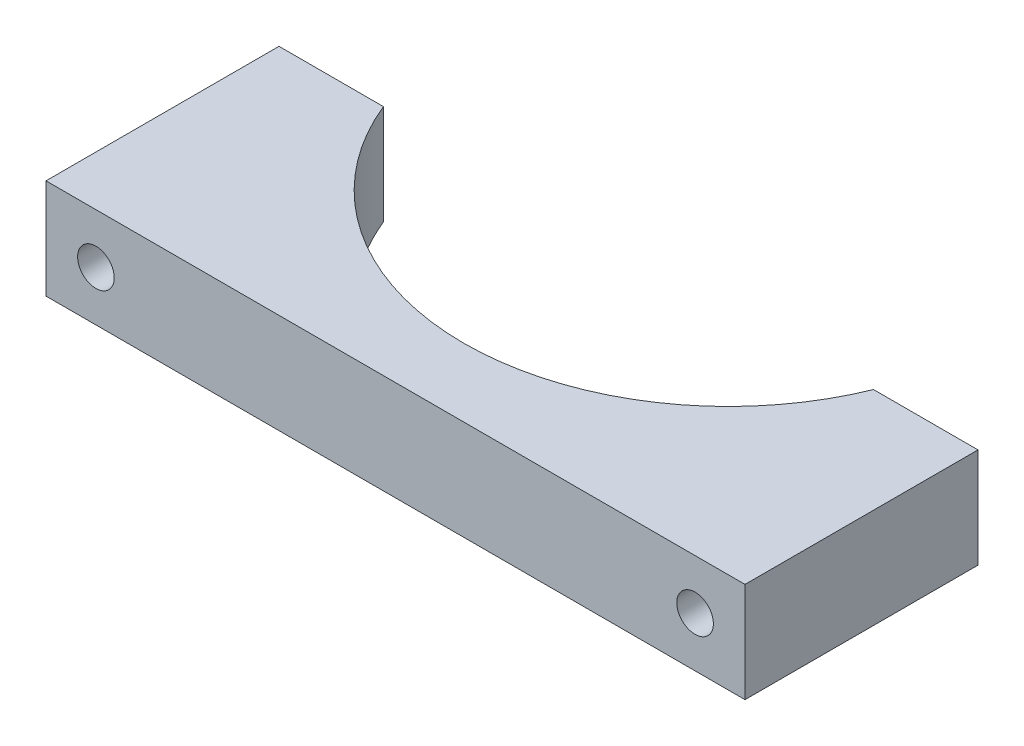
ISO-10303-21;
HEADER;
FILE_DESCRIPTION(('STEP AP214'),'2;1');
FILE_NAME('part.step','',(''),(''),'','','');
FILE_SCHEMA(('AUTOMOTIVE_DESIGN { 1 0 10303 214 1 1 1 1 }'));
ENDSEC;
DATA;
#1=APPLICATION_CONTEXT('core data for automotive mechanical design processes');
#2=APPLICATION_PROTOCOL_DEFINITION('international standard','automotive_design',2000,#1);
#3=PRODUCT_CONTEXT('',#1,'mechanical');
#4=PRODUCT('Part','Part','',(#3));
#5=PRODUCT_RELATED_PRODUCT_CATEGORY('part','',(#4));
#6=PRODUCT_DEFINITION_FORMATION('','',#4);
#7=PRODUCT_DEFINITION_CONTEXT('part definition',#1,'design');
#8=PRODUCT_DEFINITION('design','',#6,#7);
#9=PRODUCT_DEFINITION_SHAPE('','',#8);
#10=(LENGTH_UNIT() NAMED_UNIT(*) SI_UNIT(.MILLI.,.METRE.));
#11=(NAMED_UNIT(*) PLANE_ANGLE_UNIT() SI_UNIT($,.RADIAN.));
#12=(NAMED_UNIT(*) SI_UNIT($,.STERADIAN.) SOLID_ANGLE_UNIT());
#13=UNCERTAINTY_MEASURE_WITH_UNIT(LENGTH_MEASURE(1.E-05),#10,'distance_accuracy_value','');
#14=(GEOMETRIC_REPRESENTATION_CONTEXT(3) GLOBAL_UNCERTAINTY_ASSIGNED_CONTEXT((#13)) GLOBAL_UNIT_ASSIGNED_CONTEXT((#10,
#11,#12)) REPRESENTATION_CONTEXT('',''));
#15=CARTESIAN_POINT('',(0.,0.,0.));
#16=DIRECTION('',(0.,0.,1.));
#17=DIRECTION('',(1.,0.,0.));
#18=AXIS2_PLACEMENT_3D('',#15,#16,#17);
#19=CARTESIAN_POINT('',(-90.,15.,30.));
#20=DIRECTION('',(0.,0.,1.));
#21=DIRECTION('',(1.,0.,0.));
#22=AXIS2_PLACEMENT_3D('',#19,#20,#21);
#23=CYLINDRICAL_SURFACE('',#22,5.5);
#24=CARTESIAN_POINT('',(-90.,15.,30.));
#25=DIRECTION('',(0.,0.,1.));
#26=DIRECTION('',(1.,0.,0.));
#27=AXIS2_PLACEMENT_3D('',#24,#25,#26);
#28=CIRCLE('',#27,5.5);
#29=CARTESIAN_POINT('',(-84.5,15.,30.));
#30=VERTEX_POINT('',#29);
#31=EDGE_CURVE('E109',#30,#30,#28,.F.);
#32=ORIENTED_EDGE('',*,*,#31,.T.);
#33=EDGE_LOOP('',(#32));
#34=FACE_BOUND('',#33,.T.);
#35=CARTESIAN_POINT('',(-90.,15.,100.));
#36=DIRECTION('',(0.,0.,1.));
#37=DIRECTION('',(1.,0.,0.));
#38=AXIS2_PLACEMENT_3D('',#35,#36,#37);
#39=CIRCLE('',#38,5.5);
#40=CARTESIAN_POINT('',(-84.5,15.,100.));
#41=VERTEX_POINT('',#40);
#42=EDGE_CURVE('E20',#41,#41,#39,.T.);
#43=ORIENTED_EDGE('',*,*,#42,.T.);
#44=EDGE_LOOP('',(#43));
#45=FACE_BOUND('',#44,.T.);
#46=ADVANCED_FACE('F17',(#34,#45),#23,.F.);
#47=CARTESIAN_POINT('',(90.,15.,30.));
#48=DIRECTION('',(0.,0.,1.));
#49=DIRECTION('',(1.,0.,0.));
#50=AXIS2_PLACEMENT_3D('',#47,#48,#49);
#51=CYLINDRICAL_SURFACE('',#50,5.5);
#52=CARTESIAN_POINT('',(90.,15.,30.));
#53=DIRECTION('',(0.,0.,1.));
#54=DIRECTION('',(1.,0.,0.));
#55=AXIS2_PLACEMENT_3D('',#52,#53,#54);
#56=CIRCLE('',#55,5.5);
#57=CARTESIAN_POINT('',(95.5,15.,30.));
#58=VERTEX_POINT('',#57);
#59=EDGE_CURVE('E91',#58,#58,#56,.F.);
#60=ORIENTED_EDGE('',*,*,#59,.T.);
#61=EDGE_LOOP('',(#60));
#62=FACE_BOUND('',#61,.T.);
#63=CARTESIAN_POINT('',(90.,15.,100.));
#64=DIRECTION('',(0.,0.,1.));
#65=DIRECTION('',(1.,0.,0.));
#66=AXIS2_PLACEMENT_3D('',#63,#64,#65);
#67=CIRCLE('',#66,5.5);
#68=CARTESIAN_POINT('',(95.5,15.,100.));
#69=VERTEX_POINT('',#68);
#70=EDGE_CURVE('E140',#69,#69,#67,.T.);
#71=ORIENTED_EDGE('',*,*,#70,.T.);
#72=EDGE_LOOP('',(#71));
#73=FACE_BOUND('',#72,.T.);
#74=ADVANCED_FACE('F172',(#62,#73),#51,.F.);
#75=CARTESIAN_POINT('',(0.,0.,0.));
#76=DIRECTION('',(0.,-1.,0.));
#77=DIRECTION('',(0.,0.,-1.));
#78=AXIS2_PLACEMENT_3D('',#75,#76,#77);
#79=PLANE('',#78);
#80=DIRECTION('',(1.,0.,0.));
#81=VECTOR('',#80,1.);
#82=CARTESIAN_POINT('',(-142.344128348806,0.,30.));
#83=LINE('',#82,#81);
#84=CARTESIAN_POINT('',(-105.,0.,30.));
#85=VERTEX_POINT('',#84);
#86=CARTESIAN_POINT('',(-73.6223471508482,0.,30.));
#87=VERTEX_POINT('',#86);
#88=EDGE_CURVE('E75',#85,#87,#83,.T.);
#89=ORIENTED_EDGE('',*,*,#88,.T.);
#90=CARTESIAN_POINT('',(0.,0.,0.));
#91=DIRECTION('',(0.,-1.,0.));
#92=DIRECTION('',(0.,0.,-1.));
#93=AXIS2_PLACEMENT_3D('',#90,#91,#92);
#94=CIRCLE('',#93,79.5);
#95=CARTESIAN_POINT('',(73.6223471508481,0.,30.));
#96=VERTEX_POINT('',#95);
#97=EDGE_CURVE('E67',#87,#96,#94,.F.);
#98=ORIENTED_EDGE('',*,*,#97,.T.);
#99=DIRECTION('',(1.,0.,0.));
#100=VECTOR('',#99,1.);
#101=CARTESIAN_POINT('',(-142.344128348806,0.,30.));
#102=LINE('',#101,#100);
#103=CARTESIAN_POINT('',(105.,0.,30.));
#104=VERTEX_POINT('',#103);
#105=EDGE_CURVE('E73',#96,#104,#102,.T.);
#106=ORIENTED_EDGE('',*,*,#105,.T.);
#107=DIRECTION('',(0.,0.,1.));
#108=VECTOR('',#107,1.);
#109=CARTESIAN_POINT('',(105.,0.,100.));
#110=LINE('',#109,#108);
#111=CARTESIAN_POINT('',(105.,0.,100.));
#112=VERTEX_POINT('',#111);
#113=EDGE_CURVE('E102',#104,#112,#110,.T.);
#114=ORIENTED_EDGE('',*,*,#113,.T.);
#115=DIRECTION('',(-1.,0.,0.));
#116=VECTOR('',#115,1.);
#117=CARTESIAN_POINT('',(-105.,0.,100.));
#118=LINE('',#117,#116);
#119=CARTESIAN_POINT('',(-105.,0.,100.));
#120=VERTEX_POINT('',#119);
#121=EDGE_CURVE('E123',#112,#120,#118,.T.);
#122=ORIENTED_EDGE('',*,*,#121,.T.);
#123=DIRECTION('',(0.,0.,-1.));
#124=VECTOR('',#123,1.);
#125=CARTESIAN_POINT('',(-105.,0.,100.));
#126=LINE('',#125,#124);
#127=EDGE_CURVE('E122',#120,#85,#126,.T.);
#128=ORIENTED_EDGE('',*,*,#127,.T.);
#129=EDGE_LOOP('',(#89,#98,#106,#114,#122,#128));
#130=FACE_BOUND('',#129,.T.);
#131=ADVANCED_FACE('F71',(#130),#79,.T.);
#132=CARTESIAN_POINT('',(-105.,30.,100.));
#133=DIRECTION('',(0.,0.,-1.));
#134=DIRECTION('',(-1.,0.,0.));
#135=AXIS2_PLACEMENT_3D('',#132,#133,#134);
#136=PLANE('',#135);
#137=DIRECTION('',(0.,1.,0.));
#138=VECTOR('',#137,1.);
#139=CARTESIAN_POINT('',(105.,30.,100.));
#140=LINE('',#139,#138);
#141=CARTESIAN_POINT('',(105.,30.,100.));
#142=VERTEX_POINT('',#141);
#143=EDGE_CURVE('E85',#112,#142,#140,.T.);
#144=ORIENTED_EDGE('',*,*,#143,.T.);
#145=DIRECTION('',(1.,0.,0.));
#146=VECTOR('',#145,1.);
#147=CARTESIAN_POINT('',(0.,30.,100.));
#148=LINE('',#147,#146);
#149=CARTESIAN_POINT('',(-105.,30.,100.));
#150=VERTEX_POINT('',#149);
#151=EDGE_CURVE('E116',#142,#150,#148,.F.);
#152=ORIENTED_EDGE('',*,*,#151,.T.);
#153=DIRECTION('',(0.,1.,0.));
#154=VECTOR('',#153,1.);
#155=CARTESIAN_POINT('',(-105.,30.,100.));
#156=LINE('',#155,#154);
#157=EDGE_CURVE('E119',#150,#120,#156,.F.);
#158=ORIENTED_EDGE('',*,*,#157,.T.);
#159=ORIENTED_EDGE('',*,*,#121,.F.);
#160=EDGE_LOOP('',(#144,#152,#158,#159));
#161=FACE_BOUND('',#160,.T.);
#162=ORIENTED_EDGE('',*,*,#70,.F.);
#163=EDGE_LOOP('',(#162));
#164=FACE_BOUND('',#163,.T.);
#165=ORIENTED_EDGE('',*,*,#42,.F.);
#166=EDGE_LOOP('',(#165));
#167=FACE_BOUND('',#166,.T.);
#168=ADVANCED_FACE('F158',(#161,#164,#167),#136,.F.);
#169=CARTESIAN_POINT('',(-105.,30.,100.));
#170=DIRECTION('',(1.,0.,0.));
#171=DIRECTION('',(0.,0.,-1.));
#172=AXIS2_PLACEMENT_3D('',#169,#170,#171);
#173=PLANE('',#172);
#174=DIRECTION('',(0.,1.,0.));
#175=VECTOR('',#174,1.);
#176=CARTESIAN_POINT('',(-105.,0.,30.));
#177=LINE('',#176,#175);
#178=CARTESIAN_POINT('',(-105.,30.,30.));
#179=VERTEX_POINT('',#178);
#180=EDGE_CURVE('E106',#179,#85,#177,.F.);
#181=ORIENTED_EDGE('',*,*,#180,.T.);
#182=ORIENTED_EDGE('',*,*,#127,.F.);
#183=ORIENTED_EDGE('',*,*,#157,.F.);
#184=DIRECTION('',(0.,0.,-1.));
#185=VECTOR('',#184,1.);
#186=CARTESIAN_POINT('',(-105.,30.,0.));
#187=LINE('',#186,#185);
#188=EDGE_CURVE('E112',#150,#179,#187,.T.);
#189=ORIENTED_EDGE('',*,*,#188,.T.);
#190=EDGE_LOOP('',(#181,#182,#183,#189));
#191=FACE_BOUND('',#190,.T.);
#192=ADVANCED_FACE('F160',(#191),#173,.F.);
#193=CARTESIAN_POINT('',(-142.344128348806,0.,30.));
#194=DIRECTION('',(0.,0.,1.));
#195=DIRECTION('',(1.,0.,0.));
#196=AXIS2_PLACEMENT_3D('',#193,#194,#195);
#197=PLANE('',#196);
#198=DIRECTION('',(0.,-1.,0.));
#199=VECTOR('',#198,1.);
#200=CARTESIAN_POINT('',(-73.6223471508482,30.,30.));
#201=LINE('',#200,#199);
#202=CARTESIAN_POINT('',(-73.6223471508482,30.,30.));
#203=VERTEX_POINT('',#202);
#204=EDGE_CURVE('E77',#203,#87,#201,.T.);
#205=ORIENTED_EDGE('',*,*,#204,.T.);
#206=ORIENTED_EDGE('',*,*,#88,.F.);
#207=ORIENTED_EDGE('',*,*,#180,.F.);
#208=DIRECTION('',(1.,0.,0.));
#209=VECTOR('',#208,1.);
#210=CARTESIAN_POINT('',(0.,30.,30.));
#211=LINE('',#210,#209);
#212=EDGE_CURVE('E115',#179,#203,#211,.T.);
#213=ORIENTED_EDGE('',*,*,#212,.T.);
#214=EDGE_LOOP('',(#205,#206,#207,#213));
#215=FACE_BOUND('',#214,.T.);
#216=ORIENTED_EDGE('',*,*,#31,.F.);
#217=EDGE_LOOP('',(#216));
#218=FACE_BOUND('',#217,.T.);
#219=ADVANCED_FACE('F169',(#215,#218),#197,.F.);
#220=CARTESIAN_POINT('',(0.,30.,0.));
#221=DIRECTION('',(0.,-1.,0.));
#222=DIRECTION('',(0.,0.,-1.));
#223=AXIS2_PLACEMENT_3D('',#220,#221,#222);
#224=CYLINDRICAL_SURFACE('',#223,79.5);
#225=CARTESIAN_POINT('',(0.,30.,0.));
#226=DIRECTION('',(0.,-1.,0.));
#227=DIRECTION('',(0.,0.,-1.));
#228=AXIS2_PLACEMENT_3D('',#225,#226,#227);
#229=CIRCLE('',#228,79.5);
#230=CARTESIAN_POINT('',(73.6223471508481,30.,30.));
#231=VERTEX_POINT('',#230);
#232=EDGE_CURVE('E90',#203,#231,#229,.F.);
#233=ORIENTED_EDGE('',*,*,#232,.T.);
#234=DIRECTION('',(0.,1.,0.));
#235=VECTOR('',#234,1.);
#236=CARTESIAN_POINT('',(73.6223471508481,0.,30.));
#237=LINE('',#236,#235);
#238=EDGE_CURVE('E83',#231,#96,#237,.F.);
#239=ORIENTED_EDGE('',*,*,#238,.T.);
#240=ORIENTED_EDGE('',*,*,#97,.F.);
#241=ORIENTED_EDGE('',*,*,#204,.F.);
#242=EDGE_LOOP('',(#233,#239,#240,#241));
#243=FACE_BOUND('',#242,.T.);
#244=ADVANCED_FACE('F88',(#243),#224,.F.);
#245=CARTESIAN_POINT('',(-142.344128348806,0.,30.));
#246=DIRECTION('',(0.,0.,1.));
#247=DIRECTION('',(1.,0.,0.));
#248=AXIS2_PLACEMENT_3D('',#245,#246,#247);
#249=PLANE('',#248);
#250=ORIENTED_EDGE('',*,*,#238,.F.);
#251=DIRECTION('',(1.,0.,0.));
#252=VECTOR('',#251,1.);
#253=CARTESIAN_POINT('',(0.,30.,30.));
#254=LINE('',#253,#252);
#255=CARTESIAN_POINT('',(105.,30.,30.));
#256=VERTEX_POINT('',#255);
#257=EDGE_CURVE('E26',#231,#256,#254,.T.);
#258=ORIENTED_EDGE('',*,*,#257,.T.);
#259=DIRECTION('',(0.,1.,0.));
#260=VECTOR('',#259,1.);
#261=CARTESIAN_POINT('',(105.,30.,30.));
#262=LINE('',#261,#260);
#263=EDGE_CURVE('E34',#256,#104,#262,.F.);
#264=ORIENTED_EDGE('',*,*,#263,.T.);
#265=ORIENTED_EDGE('',*,*,#105,.F.);
#266=EDGE_LOOP('',(#250,#258,#264,#265));
#267=FACE_BOUND('',#266,.T.);
#268=ORIENTED_EDGE('',*,*,#59,.F.);
#269=EDGE_LOOP('',(#268));
#270=FACE_BOUND('',#269,.T.);
#271=ADVANCED_FACE('F80',(#267,#270),#249,.F.);
#272=CARTESIAN_POINT('',(105.,30.,100.));
#273=DIRECTION('',(-1.,0.,0.));
#274=DIRECTION('',(0.,0.,1.));
#275=AXIS2_PLACEMENT_3D('',#272,#273,#274);
#276=PLANE('',#275);
#277=ORIENTED_EDGE('',*,*,#263,.F.);
#278=DIRECTION('',(0.,0.,-1.));
#279=VECTOR('',#278,1.);
#280=CARTESIAN_POINT('',(105.,30.,0.));
#281=LINE('',#280,#279);
#282=EDGE_CURVE('E11',#256,#142,#281,.F.);
#283=ORIENTED_EDGE('',*,*,#282,.T.);
#284=ORIENTED_EDGE('',*,*,#143,.F.);
#285=ORIENTED_EDGE('',*,*,#113,.F.);
#286=EDGE_LOOP('',(#277,#283,#284,#285));
#287=FACE_BOUND('',#286,.T.);
#288=ADVANCED_FACE('F177',(#287),#276,.F.);
#289=CARTESIAN_POINT('',(0.,30.,0.));
#290=DIRECTION('',(0.,-1.,0.));
#291=DIRECTION('',(0.,0.,-1.));
#292=AXIS2_PLACEMENT_3D('',#289,#290,#291);
#293=PLANE('',#292);
#294=ORIENTED_EDGE('',*,*,#257,.F.);
#295=ORIENTED_EDGE('',*,*,#232,.F.);
#296=ORIENTED_EDGE('',*,*,#212,.F.);
#297=ORIENTED_EDGE('',*,*,#188,.F.);
#298=ORIENTED_EDGE('',*,*,#151,.F.);
#299=ORIENTED_EDGE('',*,*,#282,.F.);
#300=EDGE_LOOP('',(#294,#295,#296,#297,#298,#299));
#301=FACE_BOUND('',#300,.T.);
#302=ADVANCED_FACE('F175',(#301),#293,.F.);
#303=CLOSED_SHELL('',(#46,#74,#131,#168,#192,#219,#244,#271,#288,#302));
#304=MANIFOLD_SOLID_BREP('B1',#303);
#305=ADVANCED_BREP_SHAPE_REPRESENTATION('',(#18,#304),#14);
#306=SHAPE_DEFINITION_REPRESENTATION(#9,#305);
ENDSEC;
END-ISO-10303-21;
